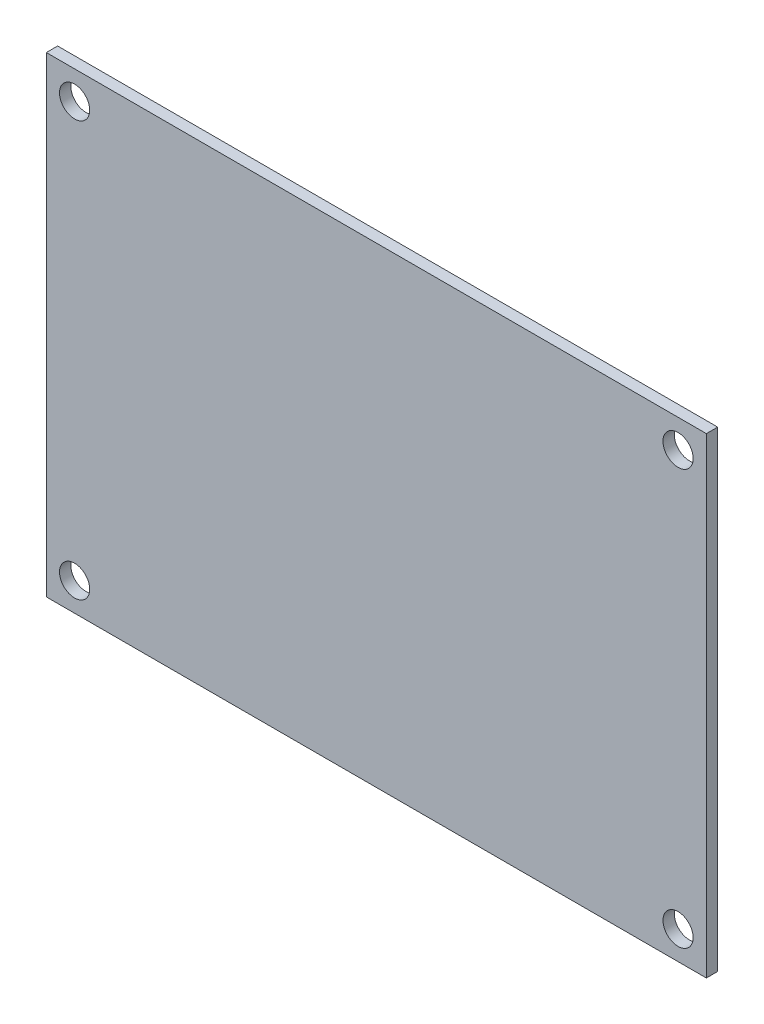
ISO-10303-21;
HEADER;
FILE_DESCRIPTION(('STEP AP214'),'2;1');
FILE_NAME('part.step','',(''),(''),'','','');
FILE_SCHEMA(('AUTOMOTIVE_DESIGN { 1 0 10303 214 1 1 1 1 }'));
ENDSEC;
DATA;
#1=APPLICATION_CONTEXT('core data for automotive mechanical design processes');
#2=APPLICATION_PROTOCOL_DEFINITION('international standard','automotive_design',2000,#1);
#3=PRODUCT_CONTEXT('',#1,'mechanical');
#4=PRODUCT('Part','Part','',(#3));
#5=PRODUCT_RELATED_PRODUCT_CATEGORY('part','',(#4));
#6=PRODUCT_DEFINITION_FORMATION('','',#4);
#7=PRODUCT_DEFINITION_CONTEXT('part definition',#1,'design');
#8=PRODUCT_DEFINITION('design','',#6,#7);
#9=PRODUCT_DEFINITION_SHAPE('','',#8);
#10=(LENGTH_UNIT() NAMED_UNIT(*) SI_UNIT(.MILLI.,.METRE.));
#11=(NAMED_UNIT(*) PLANE_ANGLE_UNIT() SI_UNIT($,.RADIAN.));
#12=(NAMED_UNIT(*) SI_UNIT($,.STERADIAN.) SOLID_ANGLE_UNIT());
#13=UNCERTAINTY_MEASURE_WITH_UNIT(LENGTH_MEASURE(1.E-05),#10,'distance_accuracy_value','');
#14=(GEOMETRIC_REPRESENTATION_CONTEXT(3) GLOBAL_UNCERTAINTY_ASSIGNED_CONTEXT((#13)) GLOBAL_UNIT_ASSIGNED_CONTEXT((#10,
#11,#12)) REPRESENTATION_CONTEXT('',''));
#15=CARTESIAN_POINT('',(0.,0.,0.));
#16=DIRECTION('',(0.,0.,1.));
#17=DIRECTION('',(1.,0.,0.));
#18=AXIS2_PLACEMENT_3D('',#15,#16,#17);
#19=CARTESIAN_POINT('',(35.,-25.,1.2));
#20=DIRECTION('',(-1.,0.,0.));
#21=DIRECTION('',(0.,0.,1.));
#22=AXIS2_PLACEMENT_3D('',#19,#20,#21);
#23=PLANE('',#22);
#24=DIRECTION('',(0.,1.,0.));
#25=VECTOR('',#24,1.);
#26=CARTESIAN_POINT('',(35.,-25.,0.));
#27=LINE('',#26,#25);
#28=CARTESIAN_POINT('',(35.,-25.,0.));
#29=VERTEX_POINT('',#28);
#30=CARTESIAN_POINT('',(35.,25.,0.));
#31=VERTEX_POINT('',#30);
#32=EDGE_CURVE('E109',#29,#31,#27,.T.);
#33=ORIENTED_EDGE('',*,*,#32,.T.);
#34=DIRECTION('',(0.,0.,-1.));
#35=VECTOR('',#34,1.);
#36=CARTESIAN_POINT('',(35.,25.,1.2));
#37=LINE('',#36,#35);
#38=CARTESIAN_POINT('',(35.,25.,1.2));
#39=VERTEX_POINT('',#38);
#40=EDGE_CURVE('E11',#39,#31,#37,.T.);
#41=ORIENTED_EDGE('',*,*,#40,.F.);
#42=DIRECTION('',(0.,1.,0.));
#43=VECTOR('',#42,1.);
#44=CARTESIAN_POINT('',(35.,-25.,1.2));
#45=LINE('',#44,#43);
#46=CARTESIAN_POINT('',(35.,-25.,1.2));
#47=VERTEX_POINT('',#46);
#48=EDGE_CURVE('E98',#47,#39,#45,.T.);
#49=ORIENTED_EDGE('',*,*,#48,.F.);
#50=DIRECTION('',(0.,0.,-1.));
#51=VECTOR('',#50,1.);
#52=CARTESIAN_POINT('',(35.,-25.,1.2));
#53=LINE('',#52,#51);
#54=EDGE_CURVE('E106',#47,#29,#53,.T.);
#55=ORIENTED_EDGE('',*,*,#54,.T.);
#56=EDGE_LOOP('',(#33,#41,#49,#55));
#57=FACE_BOUND('',#56,.T.);
#58=ADVANCED_FACE('F50',(#57),#23,.F.);
#59=CARTESIAN_POINT('',(-35.,25.,1.2));
#60=DIRECTION('',(0.,-1.,0.));
#61=DIRECTION('',(0.,0.,-1.));
#62=AXIS2_PLACEMENT_3D('',#59,#60,#61);
#63=PLANE('',#62);
#64=DIRECTION('',(-1.,0.,0.));
#65=VECTOR('',#64,1.);
#66=CARTESIAN_POINT('',(-35.,25.,0.));
#67=LINE('',#66,#65);
#68=CARTESIAN_POINT('',(-35.,25.,0.));
#69=VERTEX_POINT('',#68);
#70=EDGE_CURVE('E105',#31,#69,#67,.T.);
#71=ORIENTED_EDGE('',*,*,#70,.T.);
#72=DIRECTION('',(0.,0.,-1.));
#73=VECTOR('',#72,1.);
#74=CARTESIAN_POINT('',(-35.,25.,1.2));
#75=LINE('',#74,#73);
#76=CARTESIAN_POINT('',(-35.,25.,1.2));
#77=VERTEX_POINT('',#76);
#78=EDGE_CURVE('E54',#77,#69,#75,.T.);
#79=ORIENTED_EDGE('',*,*,#78,.F.);
#80=DIRECTION('',(-1.,0.,0.));
#81=VECTOR('',#80,1.);
#82=CARTESIAN_POINT('',(-35.,25.,1.2));
#83=LINE('',#82,#81);
#84=EDGE_CURVE('E91',#39,#77,#83,.T.);
#85=ORIENTED_EDGE('',*,*,#84,.F.);
#86=ORIENTED_EDGE('',*,*,#40,.T.);
#87=EDGE_LOOP('',(#71,#79,#85,#86));
#88=FACE_BOUND('',#87,.T.);
#89=ADVANCED_FACE('F101',(#88),#63,.F.);
#90=CARTESIAN_POINT('',(-35.,-25.,1.2));
#91=DIRECTION('',(1.,0.,0.));
#92=DIRECTION('',(0.,0.,-1.));
#93=AXIS2_PLACEMENT_3D('',#90,#91,#92);
#94=PLANE('',#93);
#95=DIRECTION('',(0.,-1.,0.));
#96=VECTOR('',#95,1.);
#97=CARTESIAN_POINT('',(-35.,-25.,0.));
#98=LINE('',#97,#96);
#99=CARTESIAN_POINT('',(-35.,-25.,0.));
#100=VERTEX_POINT('',#99);
#101=EDGE_CURVE('E78',#69,#100,#98,.T.);
#102=ORIENTED_EDGE('',*,*,#101,.T.);
#103=DIRECTION('',(0.,0.,-1.));
#104=VECTOR('',#103,1.);
#105=CARTESIAN_POINT('',(-35.,-25.,1.2));
#106=LINE('',#105,#104);
#107=CARTESIAN_POINT('',(-35.,-25.,1.2));
#108=VERTEX_POINT('',#107);
#109=EDGE_CURVE('E103',#108,#100,#106,.T.);
#110=ORIENTED_EDGE('',*,*,#109,.F.);
#111=DIRECTION('',(0.,-1.,0.));
#112=VECTOR('',#111,1.);
#113=CARTESIAN_POINT('',(-35.,-25.,1.2));
#114=LINE('',#113,#112);
#115=EDGE_CURVE('E96',#77,#108,#114,.T.);
#116=ORIENTED_EDGE('',*,*,#115,.F.);
#117=ORIENTED_EDGE('',*,*,#78,.T.);
#118=EDGE_LOOP('',(#102,#110,#116,#117));
#119=FACE_BOUND('',#118,.T.);
#120=ADVANCED_FACE('F102',(#119),#94,.F.);
#121=CARTESIAN_POINT('',(-35.,-25.,1.2));
#122=DIRECTION('',(0.,1.,0.));
#123=DIRECTION('',(0.,0.,1.));
#124=AXIS2_PLACEMENT_3D('',#121,#122,#123);
#125=PLANE('',#124);
#126=DIRECTION('',(1.,0.,0.));
#127=VECTOR('',#126,1.);
#128=CARTESIAN_POINT('',(-35.,-25.,0.));
#129=LINE('',#128,#127);
#130=EDGE_CURVE('E88',#100,#29,#129,.T.);
#131=ORIENTED_EDGE('',*,*,#130,.T.);
#132=ORIENTED_EDGE('',*,*,#54,.F.);
#133=DIRECTION('',(1.,0.,0.));
#134=VECTOR('',#133,1.);
#135=CARTESIAN_POINT('',(-35.,-25.,1.2));
#136=LINE('',#135,#134);
#137=EDGE_CURVE('E64',#108,#47,#136,.T.);
#138=ORIENTED_EDGE('',*,*,#137,.F.);
#139=ORIENTED_EDGE('',*,*,#109,.T.);
#140=EDGE_LOOP('',(#131,#132,#138,#139));
#141=FACE_BOUND('',#140,.T.);
#142=ADVANCED_FACE('F119',(#141),#125,.F.);
#143=CARTESIAN_POINT('',(0.,0.,1.2));
#144=DIRECTION('',(0.,0.,-1.));
#145=DIRECTION('',(-1.,0.,0.));
#146=AXIS2_PLACEMENT_3D('',#143,#144,#145);
#147=PLANE('',#146);
#148=CARTESIAN_POINT('',(-32.,22.,1.2));
#149=DIRECTION('',(0.,0.,1.));
#150=DIRECTION('',(-1.,0.,0.));
#151=AXIS2_PLACEMENT_3D('',#148,#149,#150);
#152=CIRCLE('',#151,1.6);
#153=CARTESIAN_POINT('',(-33.6,22.,1.2));
#154=VERTEX_POINT('',#153);
#155=EDGE_CURVE('E128',#154,#154,#152,.T.);
#156=ORIENTED_EDGE('',*,*,#155,.F.);
#157=EDGE_LOOP('',(#156));
#158=FACE_BOUND('',#157,.T.);
#159=CARTESIAN_POINT('',(32.,22.,1.2));
#160=DIRECTION('',(0.,0.,1.));
#161=DIRECTION('',(1.,0.,0.));
#162=AXIS2_PLACEMENT_3D('',#159,#160,#161);
#163=CIRCLE('',#162,1.6);
#164=CARTESIAN_POINT('',(33.6,22.,1.2));
#165=VERTEX_POINT('',#164);
#166=EDGE_CURVE('E137',#165,#165,#163,.T.);
#167=ORIENTED_EDGE('',*,*,#166,.F.);
#168=EDGE_LOOP('',(#167));
#169=FACE_BOUND('',#168,.T.);
#170=CARTESIAN_POINT('',(32.,-22.,1.2));
#171=DIRECTION('',(0.,0.,1.));
#172=DIRECTION('',(-1.,0.,0.));
#173=AXIS2_PLACEMENT_3D('',#170,#171,#172);
#174=CIRCLE('',#173,1.6);
#175=CARTESIAN_POINT('',(30.4,-22.,1.2));
#176=VERTEX_POINT('',#175);
#177=EDGE_CURVE('E142',#176,#176,#174,.T.);
#178=ORIENTED_EDGE('',*,*,#177,.F.);
#179=EDGE_LOOP('',(#178));
#180=FACE_BOUND('',#179,.T.);
#181=CARTESIAN_POINT('',(-32.,-22.,1.2));
#182=DIRECTION('',(0.,0.,1.));
#183=DIRECTION('',(1.,0.,0.));
#184=AXIS2_PLACEMENT_3D('',#181,#182,#183);
#185=CIRCLE('',#184,1.6);
#186=CARTESIAN_POINT('',(-30.4,-22.,1.2));
#187=VERTEX_POINT('',#186);
#188=EDGE_CURVE('E114',#187,#187,#185,.T.);
#189=ORIENTED_EDGE('',*,*,#188,.F.);
#190=EDGE_LOOP('',(#189));
#191=FACE_BOUND('',#190,.T.);
#192=ORIENTED_EDGE('',*,*,#48,.T.);
#193=ORIENTED_EDGE('',*,*,#84,.T.);
#194=ORIENTED_EDGE('',*,*,#115,.T.);
#195=ORIENTED_EDGE('',*,*,#137,.T.);
#196=EDGE_LOOP('',(#192,#193,#194,#195));
#197=FACE_BOUND('',#196,.T.);
#198=ADVANCED_FACE('F94',(#158,#169,#180,#191,#197),#147,.F.);
#199=CARTESIAN_POINT('',(0.,0.,0.));
#200=DIRECTION('',(0.,0.,-1.));
#201=DIRECTION('',(-1.,0.,0.));
#202=AXIS2_PLACEMENT_3D('',#199,#200,#201);
#203=PLANE('',#202);
#204=CARTESIAN_POINT('',(-32.,22.,0.));
#205=DIRECTION('',(0.,0.,-1.));
#206=DIRECTION('',(-1.,0.,0.));
#207=AXIS2_PLACEMENT_3D('',#204,#205,#206);
#208=CIRCLE('',#207,1.6);
#209=CARTESIAN_POINT('',(-33.6,22.,0.));
#210=VERTEX_POINT('',#209);
#211=EDGE_CURVE('E134',#210,#210,#208,.F.);
#212=ORIENTED_EDGE('',*,*,#211,.T.);
#213=EDGE_LOOP('',(#212));
#214=FACE_BOUND('',#213,.T.);
#215=CARTESIAN_POINT('',(32.,22.,0.));
#216=DIRECTION('',(0.,0.,-1.));
#217=DIRECTION('',(-1.,0.,0.));
#218=AXIS2_PLACEMENT_3D('',#215,#216,#217);
#219=CIRCLE('',#218,1.6);
#220=CARTESIAN_POINT('',(30.4,22.,0.));
#221=VERTEX_POINT('',#220);
#222=EDGE_CURVE('E139',#221,#221,#219,.F.);
#223=ORIENTED_EDGE('',*,*,#222,.T.);
#224=EDGE_LOOP('',(#223));
#225=FACE_BOUND('',#224,.T.);
#226=CARTESIAN_POINT('',(32.,-22.,0.));
#227=DIRECTION('',(0.,0.,-1.));
#228=DIRECTION('',(-1.,0.,0.));
#229=AXIS2_PLACEMENT_3D('',#226,#227,#228);
#230=CIRCLE('',#229,1.6);
#231=CARTESIAN_POINT('',(30.4,-22.,0.));
#232=VERTEX_POINT('',#231);
#233=EDGE_CURVE('E130',#232,#232,#230,.F.);
#234=ORIENTED_EDGE('',*,*,#233,.T.);
#235=EDGE_LOOP('',(#234));
#236=FACE_BOUND('',#235,.T.);
#237=CARTESIAN_POINT('',(-32.,-22.,0.));
#238=DIRECTION('',(0.,0.,-1.));
#239=DIRECTION('',(-1.,0.,0.));
#240=AXIS2_PLACEMENT_3D('',#237,#238,#239);
#241=CIRCLE('',#240,1.6);
#242=CARTESIAN_POINT('',(-33.6,-22.,0.));
#243=VERTEX_POINT('',#242);
#244=EDGE_CURVE('E124',#243,#243,#241,.F.);
#245=ORIENTED_EDGE('',*,*,#244,.T.);
#246=EDGE_LOOP('',(#245));
#247=FACE_BOUND('',#246,.T.);
#248=ORIENTED_EDGE('',*,*,#32,.F.);
#249=ORIENTED_EDGE('',*,*,#130,.F.);
#250=ORIENTED_EDGE('',*,*,#101,.F.);
#251=ORIENTED_EDGE('',*,*,#70,.F.);
#252=EDGE_LOOP('',(#248,#249,#250,#251));
#253=FACE_BOUND('',#252,.T.);
#254=ADVANCED_FACE('F122',(#214,#225,#236,#247,#253),#203,.T.);
#255=CARTESIAN_POINT('',(-32.,-22.,-0.000999999999999916));
#256=DIRECTION('',(0.,0.,1.));
#257=DIRECTION('',(1.,0.,0.));
#258=AXIS2_PLACEMENT_3D('',#255,#256,#257);
#259=CYLINDRICAL_SURFACE('',#258,1.6);
#260=ORIENTED_EDGE('',*,*,#244,.F.);
#261=EDGE_LOOP('',(#260));
#262=FACE_BOUND('',#261,.T.);
#263=ORIENTED_EDGE('',*,*,#188,.T.);
#264=EDGE_LOOP('',(#263));
#265=FACE_BOUND('',#264,.T.);
#266=ADVANCED_FACE('F152',(#262,#265),#259,.F.);
#267=CARTESIAN_POINT('',(32.,-22.,-0.000999999999999916));
#268=DIRECTION('',(0.,0.,1.));
#269=DIRECTION('',(1.,0.,0.));
#270=AXIS2_PLACEMENT_3D('',#267,#268,#269);
#271=CYLINDRICAL_SURFACE('',#270,1.6);
#272=ORIENTED_EDGE('',*,*,#233,.F.);
#273=EDGE_LOOP('',(#272));
#274=FACE_BOUND('',#273,.T.);
#275=ORIENTED_EDGE('',*,*,#177,.T.);
#276=EDGE_LOOP('',(#275));
#277=FACE_BOUND('',#276,.T.);
#278=ADVANCED_FACE('F147',(#274,#277),#271,.F.);
#279=CARTESIAN_POINT('',(32.,22.,-0.000999999999999916));
#280=DIRECTION('',(0.,0.,1.));
#281=DIRECTION('',(1.,0.,0.));
#282=AXIS2_PLACEMENT_3D('',#279,#280,#281);
#283=CYLINDRICAL_SURFACE('',#282,1.6);
#284=ORIENTED_EDGE('',*,*,#222,.F.);
#285=EDGE_LOOP('',(#284));
#286=FACE_BOUND('',#285,.T.);
#287=ORIENTED_EDGE('',*,*,#166,.T.);
#288=EDGE_LOOP('',(#287));
#289=FACE_BOUND('',#288,.T.);
#290=ADVANCED_FACE('F153',(#286,#289),#283,.F.);
#291=CARTESIAN_POINT('',(-32.,22.,-0.000999999999999916));
#292=DIRECTION('',(0.,0.,1.));
#293=DIRECTION('',(1.,0.,0.));
#294=AXIS2_PLACEMENT_3D('',#291,#292,#293);
#295=CYLINDRICAL_SURFACE('',#294,1.6);
#296=ORIENTED_EDGE('',*,*,#211,.F.);
#297=EDGE_LOOP('',(#296));
#298=FACE_BOUND('',#297,.T.);
#299=ORIENTED_EDGE('',*,*,#155,.T.);
#300=EDGE_LOOP('',(#299));
#301=FACE_BOUND('',#300,.T.);
#302=ADVANCED_FACE('F217',(#298,#301),#295,.F.);
#303=CLOSED_SHELL('',(#58,#89,#120,#142,#198,#254,#266,#278,#290,#302));
#304=MANIFOLD_SOLID_BREP('B2',#303);
#305=ADVANCED_BREP_SHAPE_REPRESENTATION('',(#18,#304),#14);
#306=SHAPE_DEFINITION_REPRESENTATION(#9,#305);
ENDSEC;
END-ISO-10303-21;
